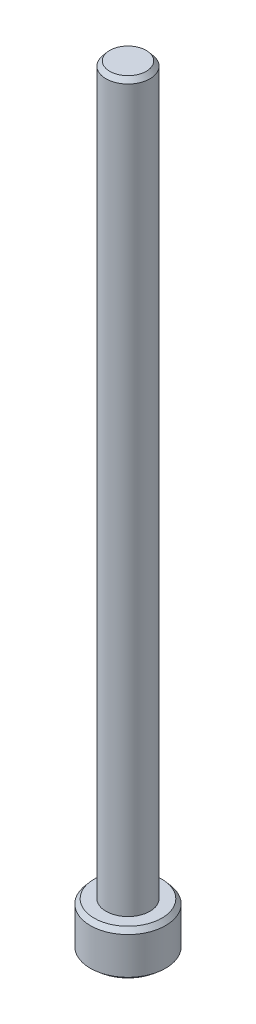
ISO-10303-21;
HEADER;
FILE_DESCRIPTION(('STEP AP214'),'2;1');
FILE_NAME('part.step','',(''),(''),'','','');
FILE_SCHEMA(('AUTOMOTIVE_DESIGN { 1 0 10303 214 1 1 1 1 }'));
ENDSEC;
DATA;
#1=APPLICATION_CONTEXT('core data for automotive mechanical design processes');
#2=APPLICATION_PROTOCOL_DEFINITION('international standard','automotive_design',2000,#1);
#3=PRODUCT_CONTEXT('',#1,'mechanical');
#4=PRODUCT('Part','Part','',(#3));
#5=PRODUCT_RELATED_PRODUCT_CATEGORY('part','',(#4));
#6=PRODUCT_DEFINITION_FORMATION('','',#4);
#7=PRODUCT_DEFINITION_CONTEXT('part definition',#1,'design');
#8=PRODUCT_DEFINITION('design','',#6,#7);
#9=PRODUCT_DEFINITION_SHAPE('','',#8);
#10=(LENGTH_UNIT() NAMED_UNIT(*) SI_UNIT(.MILLI.,.METRE.));
#11=(NAMED_UNIT(*) PLANE_ANGLE_UNIT() SI_UNIT($,.RADIAN.));
#12=(NAMED_UNIT(*) SI_UNIT($,.STERADIAN.) SOLID_ANGLE_UNIT());
#13=UNCERTAINTY_MEASURE_WITH_UNIT(LENGTH_MEASURE(1.E-05),#10,'distance_accuracy_value','');
#14=(GEOMETRIC_REPRESENTATION_CONTEXT(3) GLOBAL_UNCERTAINTY_ASSIGNED_CONTEXT((#13)) GLOBAL_UNIT_ASSIGNED_CONTEXT((#10,
#11,#12)) REPRESENTATION_CONTEXT('',''));
#15=CARTESIAN_POINT('',(0.,0.,0.));
#16=DIRECTION('',(0.,0.,1.));
#17=DIRECTION('',(1.,0.,0.));
#18=AXIS2_PLACEMENT_3D('',#15,#16,#17);
#19=CARTESIAN_POINT('',(0.,5.,0.));
#20=DIRECTION('',(0.,-1.,0.));
#21=DIRECTION('',(0.,0.,-1.));
#22=AXIS2_PLACEMENT_3D('',#19,#20,#21);
#23=CYLINDRICAL_SURFACE('',#22,4.15);
#24=CARTESIAN_POINT('',(0.,0.419549815588637,0.));
#25=DIRECTION('',(0.,1.,0.));
#26=DIRECTION('',(0.,0.,1.));
#27=AXIS2_PLACEMENT_3D('',#24,#25,#26);
#28=CIRCLE('',#27,4.15);
#29=CARTESIAN_POINT('',(0.,0.419549815588637,4.15));
#30=VERTEX_POINT('',#29);
#31=EDGE_CURVE('E181',#30,#30,#28,.T.);
#32=ORIENTED_EDGE('',*,*,#31,.T.);
#33=EDGE_LOOP('',(#32));
#34=FACE_BOUND('',#33,.T.);
#35=CARTESIAN_POINT('',(0.,4.49999999999999,0.));
#36=DIRECTION('',(0.,1.,0.));
#37=DIRECTION('',(0.,0.,1.));
#38=AXIS2_PLACEMENT_3D('',#35,#36,#37);
#39=CIRCLE('',#38,4.15);
#40=CARTESIAN_POINT('',(0.,4.49999999999999,4.15));
#41=VERTEX_POINT('',#40);
#42=EDGE_CURVE('E177',#41,#41,#39,.F.);
#43=ORIENTED_EDGE('',*,*,#42,.T.);
#44=EDGE_LOOP('',(#43));
#45=FACE_BOUND('',#44,.T.);
#46=ADVANCED_FACE('F48',(#34,#45),#23,.T.);
#47=CARTESIAN_POINT('',(0.,5.,0.));
#48=DIRECTION('',(0.,1.,0.));
#49=DIRECTION('',(0.,0.,1.));
#50=AXIS2_PLACEMENT_3D('',#47,#48,#49);
#51=PLANE('',#50);
#52=CARTESIAN_POINT('',(0.,5.,0.));
#53=DIRECTION('',(0.,1.,0.));
#54=DIRECTION('',(0.,0.,1.));
#55=AXIS2_PLACEMENT_3D('',#52,#53,#54);
#56=CIRCLE('',#55,3.73045018441135);
#57=CARTESIAN_POINT('',(0.,5.,3.73045018441135));
#58=VERTEX_POINT('',#57);
#59=EDGE_CURVE('E189',#58,#58,#56,.T.);
#60=ORIENTED_EDGE('',*,*,#59,.T.);
#61=EDGE_LOOP('',(#60));
#62=FACE_BOUND('',#61,.T.);
#63=CARTESIAN_POINT('',(0.,5.,0.));
#64=DIRECTION('',(0.,1.,0.));
#65=DIRECTION('',(0.,0.,1.));
#66=AXIS2_PLACEMENT_3D('',#63,#64,#65);
#67=CIRCLE('',#66,2.425);
#68=CARTESIAN_POINT('',(0.,5.,2.425));
#69=VERTEX_POINT('',#68);
#70=EDGE_CURVE('E165',#69,#69,#67,.T.);
#71=ORIENTED_EDGE('',*,*,#70,.F.);
#72=EDGE_LOOP('',(#71));
#73=FACE_BOUND('',#72,.T.);
#74=ADVANCED_FACE('F208',(#62,#73),#51,.T.);
#75=CARTESIAN_POINT('',(0.,0.,0.));
#76=DIRECTION('',(0.,1.,0.));
#77=DIRECTION('',(0.,0.,1.));
#78=AXIS2_PLACEMENT_3D('',#75,#76,#77);
#79=PLANE('',#78);
#80=CARTESIAN_POINT('',(0.,0.,0.));
#81=DIRECTION('',(0.,1.,0.));
#82=DIRECTION('',(0.,0.,1.));
#83=AXIS2_PLACEMENT_3D('',#80,#81,#82);
#84=CIRCLE('',#83,3.65000000000001);
#85=CARTESIAN_POINT('',(0.,0.,3.65000000000001));
#86=VERTEX_POINT('',#85);
#87=EDGE_CURVE('E185',#86,#86,#84,.F.);
#88=ORIENTED_EDGE('',*,*,#87,.T.);
#89=EDGE_LOOP('',(#88));
#90=FACE_BOUND('',#89,.T.);
#91=DIRECTION('',(-0.866025403784438,0.,-0.500000000000001));
#92=VECTOR('',#91,1.);
#93=CARTESIAN_POINT('',(0.,0.,2.78604186468078));
#94=LINE('',#93,#92);
#95=CARTESIAN_POINT('',(0.,0.,2.78604186468078));
#96=VERTEX_POINT('',#95);
#97=CARTESIAN_POINT('',(-2.41278303082053,0.,1.39302093234039));
#98=VERTEX_POINT('',#97);
#99=EDGE_CURVE('E147',#96,#98,#94,.T.);
#100=ORIENTED_EDGE('',*,*,#99,.F.);
#101=DIRECTION('',(-0.866025403784441,0.,0.499999999999995));
#102=VECTOR('',#101,1.);
#103=CARTESIAN_POINT('',(2.41278303082051,0.,1.39302093234042));
#104=LINE('',#103,#102);
#105=CARTESIAN_POINT('',(2.41278303082051,0.,1.39302093234042));
#106=VERTEX_POINT('',#105);
#107=EDGE_CURVE('E65',#106,#96,#104,.T.);
#108=ORIENTED_EDGE('',*,*,#107,.F.);
#109=DIRECTION('',(0.,0.,1.));
#110=VECTOR('',#109,1.);
#111=CARTESIAN_POINT('',(2.41278303082054,0.,-1.39302093234037));
#112=LINE('',#111,#110);
#113=CARTESIAN_POINT('',(2.41278303082054,0.,-1.39302093234037));
#114=VERTEX_POINT('',#113);
#115=EDGE_CURVE('E159',#114,#106,#112,.T.);
#116=ORIENTED_EDGE('',*,*,#115,.F.);
#117=DIRECTION('',(0.866025403784434,0.,0.500000000000007));
#118=VECTOR('',#117,1.);
#119=CARTESIAN_POINT('',(0.,0.,-2.78604186468078));
#120=LINE('',#119,#118);
#121=CARTESIAN_POINT('',(0.,0.,-2.78604186468078));
#122=VERTEX_POINT('',#121);
#123=EDGE_CURVE('E156',#122,#114,#120,.T.);
#124=ORIENTED_EDGE('',*,*,#123,.F.);
#125=DIRECTION('',(0.866025403784442,0.,-0.499999999999995));
#126=VECTOR('',#125,1.);
#127=CARTESIAN_POINT('',(-2.41278303082052,0.,-1.3930209323404));
#128=LINE('',#127,#126);
#129=CARTESIAN_POINT('',(-2.41278303082052,0.,-1.3930209323404));
#130=VERTEX_POINT('',#129);
#131=EDGE_CURVE('E113',#130,#122,#128,.T.);
#132=ORIENTED_EDGE('',*,*,#131,.F.);
#133=DIRECTION('',(0.,0.,-1.));
#134=VECTOR('',#133,1.);
#135=CARTESIAN_POINT('',(-2.41278303082053,0.,1.39302093234039));
#136=LINE('',#135,#134);
#137=EDGE_CURVE('E151',#98,#130,#136,.T.);
#138=ORIENTED_EDGE('',*,*,#137,.F.);
#139=EDGE_LOOP('',(#100,#108,#116,#124,#132,#138));
#140=FACE_BOUND('',#139,.T.);
#141=ADVANCED_FACE('F214',(#90,#140),#79,.F.);
#142=CARTESIAN_POINT('',(0.,85.,0.));
#143=DIRECTION('',(0.,-1.,0.));
#144=DIRECTION('',(0.,0.,-1.));
#145=AXIS2_PLACEMENT_3D('',#142,#143,#144);
#146=CYLINDRICAL_SURFACE('',#145,2.425);
#147=CARTESIAN_POINT('',(0.,84.5,0.));
#148=DIRECTION('',(0.,1.,0.));
#149=DIRECTION('',(0.,0.,1.));
#150=AXIS2_PLACEMENT_3D('',#147,#148,#149);
#151=CIRCLE('',#150,2.425);
#152=CARTESIAN_POINT('',(0.,84.5,2.425));
#153=VERTEX_POINT('',#152);
#154=EDGE_CURVE('E11',#153,#153,#151,.F.);
#155=ORIENTED_EDGE('',*,*,#154,.T.);
#156=EDGE_LOOP('',(#155));
#157=FACE_BOUND('',#156,.T.);
#158=ORIENTED_EDGE('',*,*,#70,.T.);
#159=EDGE_LOOP('',(#158));
#160=FACE_BOUND('',#159,.T.);
#161=ADVANCED_FACE('F241',(#157,#160),#146,.T.);
#162=CARTESIAN_POINT('',(0.,85.,0.));
#163=DIRECTION('',(0.,1.,0.));
#164=DIRECTION('',(0.,0.,1.));
#165=AXIS2_PLACEMENT_3D('',#162,#163,#164);
#166=PLANE('',#165);
#167=CARTESIAN_POINT('',(0.,85.,0.));
#168=DIRECTION('',(0.,1.,0.));
#169=DIRECTION('',(0.,0.,1.));
#170=AXIS2_PLACEMENT_3D('',#167,#168,#169);
#171=CIRCLE('',#170,2.00545018441137);
#172=CARTESIAN_POINT('',(0.,85.,2.00545018441137));
#173=VERTEX_POINT('',#172);
#174=EDGE_CURVE('E58',#173,#173,#171,.T.);
#175=ORIENTED_EDGE('',*,*,#174,.T.);
#176=EDGE_LOOP('',(#175));
#177=FACE_BOUND('',#176,.T.);
#178=ADVANCED_FACE('F196',(#177),#166,.T.);
#179=CARTESIAN_POINT('',(2.41278303082051,3.,1.39302093234042));
#180=DIRECTION('',(0.499999999999995,0.,0.866025403784441));
#181=DIRECTION('',(0.866025403784441,0.,-0.499999999999995));
#182=AXIS2_PLACEMENT_3D('',#179,#180,#181);
#183=PLANE('',#182);
#184=ORIENTED_EDGE('',*,*,#107,.T.);
#185=DIRECTION('',(0.,-1.,0.));
#186=VECTOR('',#185,1.);
#187=CARTESIAN_POINT('',(0.,3.,2.78604186468078));
#188=LINE('',#187,#186);
#189=CARTESIAN_POINT('',(0.,3.,2.78604186468078));
#190=VERTEX_POINT('',#189);
#191=EDGE_CURVE('E95',#190,#96,#188,.T.);
#192=ORIENTED_EDGE('',*,*,#191,.F.);
#193=DIRECTION('',(-0.866025403784441,0.,0.499999999999995));
#194=VECTOR('',#193,1.);
#195=CARTESIAN_POINT('',(2.41278303082051,3.,1.39302093234042));
#196=LINE('',#195,#194);
#197=CARTESIAN_POINT('',(2.41278303082051,3.,1.39302093234042));
#198=VERTEX_POINT('',#197);
#199=EDGE_CURVE('E162',#198,#190,#196,.T.);
#200=ORIENTED_EDGE('',*,*,#199,.F.);
#201=DIRECTION('',(0.,-1.,0.));
#202=VECTOR('',#201,1.);
#203=CARTESIAN_POINT('',(2.41278303082051,3.,1.39302093234042));
#204=LINE('',#203,#202);
#205=EDGE_CURVE('E73',#198,#106,#204,.T.);
#206=ORIENTED_EDGE('',*,*,#205,.T.);
#207=EDGE_LOOP('',(#184,#192,#200,#206));
#208=FACE_BOUND('',#207,.T.);
#209=ADVANCED_FACE('F293',(#208),#183,.F.);
#210=CARTESIAN_POINT('',(2.41278303082054,3.,-1.39302093234037));
#211=DIRECTION('',(1.,0.,0.));
#212=DIRECTION('',(0.,0.,-1.));
#213=AXIS2_PLACEMENT_3D('',#210,#211,#212);
#214=PLANE('',#213);
#215=ORIENTED_EDGE('',*,*,#115,.T.);
#216=ORIENTED_EDGE('',*,*,#205,.F.);
#217=DIRECTION('',(0.,0.,1.));
#218=VECTOR('',#217,1.);
#219=CARTESIAN_POINT('',(2.41278303082054,3.,-1.39302093234037));
#220=LINE('',#219,#218);
#221=CARTESIAN_POINT('',(2.41278303082054,3.,-1.39302093234037));
#222=VERTEX_POINT('',#221);
#223=EDGE_CURVE('E127',#222,#198,#220,.T.);
#224=ORIENTED_EDGE('',*,*,#223,.F.);
#225=DIRECTION('',(0.,-1.,0.));
#226=VECTOR('',#225,1.);
#227=CARTESIAN_POINT('',(2.41278303082054,3.,-1.39302093234037));
#228=LINE('',#227,#226);
#229=EDGE_CURVE('E118',#222,#114,#228,.T.);
#230=ORIENTED_EDGE('',*,*,#229,.T.);
#231=EDGE_LOOP('',(#215,#216,#224,#230));
#232=FACE_BOUND('',#231,.T.);
#233=ADVANCED_FACE('F301',(#232),#214,.F.);
#234=CARTESIAN_POINT('',(0.,3.,-2.78604186468078));
#235=DIRECTION('',(0.500000000000007,0.,-0.866025403784435));
#236=DIRECTION('',(-0.866025403784434,0.,-0.500000000000007));
#237=AXIS2_PLACEMENT_3D('',#234,#235,#236);
#238=PLANE('',#237);
#239=ORIENTED_EDGE('',*,*,#123,.T.);
#240=ORIENTED_EDGE('',*,*,#229,.F.);
#241=DIRECTION('',(0.866025403784434,0.,0.500000000000007));
#242=VECTOR('',#241,1.);
#243=CARTESIAN_POINT('',(0.,3.,-2.78604186468078));
#244=LINE('',#243,#242);
#245=CARTESIAN_POINT('',(0.,3.,-2.78604186468078));
#246=VERTEX_POINT('',#245);
#247=EDGE_CURVE('E122',#246,#222,#244,.T.);
#248=ORIENTED_EDGE('',*,*,#247,.F.);
#249=DIRECTION('',(0.,-1.,0.));
#250=VECTOR('',#249,1.);
#251=CARTESIAN_POINT('',(0.,3.,-2.78604186468078));
#252=LINE('',#251,#250);
#253=EDGE_CURVE('E106',#246,#122,#252,.T.);
#254=ORIENTED_EDGE('',*,*,#253,.T.);
#255=EDGE_LOOP('',(#239,#240,#248,#254));
#256=FACE_BOUND('',#255,.T.);
#257=ADVANCED_FACE('F123',(#256),#238,.F.);
#258=CARTESIAN_POINT('',(-2.41278303082052,3.,-1.3930209323404));
#259=DIRECTION('',(-0.499999999999995,0.,-0.866025403784441));
#260=DIRECTION('',(-0.866025403784442,0.,0.499999999999995));
#261=AXIS2_PLACEMENT_3D('',#258,#259,#260);
#262=PLANE('',#261);
#263=ORIENTED_EDGE('',*,*,#131,.T.);
#264=ORIENTED_EDGE('',*,*,#253,.F.);
#265=DIRECTION('',(0.866025403784442,0.,-0.499999999999995));
#266=VECTOR('',#265,1.);
#267=CARTESIAN_POINT('',(-2.41278303082052,3.,-1.3930209323404));
#268=LINE('',#267,#266);
#269=CARTESIAN_POINT('',(-2.41278303082052,3.,-1.3930209323404));
#270=VERTEX_POINT('',#269);
#271=EDGE_CURVE('E110',#270,#246,#268,.T.);
#272=ORIENTED_EDGE('',*,*,#271,.F.);
#273=DIRECTION('',(0.,-1.,0.));
#274=VECTOR('',#273,1.);
#275=CARTESIAN_POINT('',(-2.41278303082052,3.,-1.3930209323404));
#276=LINE('',#275,#274);
#277=EDGE_CURVE('E119',#270,#130,#276,.T.);
#278=ORIENTED_EDGE('',*,*,#277,.T.);
#279=EDGE_LOOP('',(#263,#264,#272,#278));
#280=FACE_BOUND('',#279,.T.);
#281=ADVANCED_FACE('F108',(#280),#262,.F.);
#282=CARTESIAN_POINT('',(-2.41278303082053,3.,1.39302093234039));
#283=DIRECTION('',(-1.,0.,0.));
#284=DIRECTION('',(0.,0.,1.));
#285=AXIS2_PLACEMENT_3D('',#282,#283,#284);
#286=PLANE('',#285);
#287=ORIENTED_EDGE('',*,*,#137,.T.);
#288=ORIENTED_EDGE('',*,*,#277,.F.);
#289=DIRECTION('',(0.,0.,-1.));
#290=VECTOR('',#289,1.);
#291=CARTESIAN_POINT('',(-2.41278303082053,3.,1.39302093234039));
#292=LINE('',#291,#290);
#293=CARTESIAN_POINT('',(-2.41278303082053,3.,1.39302093234039));
#294=VERTEX_POINT('',#293);
#295=EDGE_CURVE('E133',#294,#270,#292,.T.);
#296=ORIENTED_EDGE('',*,*,#295,.F.);
#297=DIRECTION('',(0.,-1.,0.));
#298=VECTOR('',#297,1.);
#299=CARTESIAN_POINT('',(-2.41278303082053,3.,1.39302093234039));
#300=LINE('',#299,#298);
#301=EDGE_CURVE('E169',#294,#98,#300,.T.);
#302=ORIENTED_EDGE('',*,*,#301,.T.);
#303=EDGE_LOOP('',(#287,#288,#296,#302));
#304=FACE_BOUND('',#303,.T.);
#305=ADVANCED_FACE('F323',(#304),#286,.F.);
#306=CARTESIAN_POINT('',(0.,3.,2.78604186468078));
#307=DIRECTION('',(-0.500000000000001,0.,0.866025403784438));
#308=DIRECTION('',(0.866025403784438,0.,0.500000000000001));
#309=AXIS2_PLACEMENT_3D('',#306,#307,#308);
#310=PLANE('',#309);
#311=ORIENTED_EDGE('',*,*,#99,.T.);
#312=ORIENTED_EDGE('',*,*,#301,.F.);
#313=DIRECTION('',(-0.866025403784438,0.,-0.500000000000001));
#314=VECTOR('',#313,1.);
#315=CARTESIAN_POINT('',(0.,3.,2.78604186468078));
#316=LINE('',#315,#314);
#317=EDGE_CURVE('E139',#190,#294,#316,.T.);
#318=ORIENTED_EDGE('',*,*,#317,.F.);
#319=ORIENTED_EDGE('',*,*,#191,.T.);
#320=EDGE_LOOP('',(#311,#312,#318,#319));
#321=FACE_BOUND('',#320,.T.);
#322=ADVANCED_FACE('F233',(#321),#310,.F.);
#323=CARTESIAN_POINT('',(0.,3.,0.));
#324=DIRECTION('',(0.,-1.,0.));
#325=DIRECTION('',(0.,0.,-1.));
#326=AXIS2_PLACEMENT_3D('',#323,#324,#325);
#327=PLANE('',#326);
#328=ORIENTED_EDGE('',*,*,#199,.T.);
#329=ORIENTED_EDGE('',*,*,#317,.T.);
#330=ORIENTED_EDGE('',*,*,#295,.T.);
#331=ORIENTED_EDGE('',*,*,#271,.T.);
#332=ORIENTED_EDGE('',*,*,#247,.T.);
#333=ORIENTED_EDGE('',*,*,#223,.T.);
#334=EDGE_LOOP('',(#328,#329,#330,#331,#332,#333));
#335=FACE_BOUND('',#334,.T.);
#336=ADVANCED_FACE('F130',(#335),#327,.T.);
#337=CARTESIAN_POINT('',(0.,0.419549815588637,0.));
#338=DIRECTION('',(0.,1.,0.));
#339=DIRECTION('',(0.,0.,1.));
#340=AXIS2_PLACEMENT_3D('',#337,#338,#339);
#341=CONICAL_SURFACE('',#340,4.15,0.872664625997161);
#342=ORIENTED_EDGE('',*,*,#87,.F.);
#343=EDGE_LOOP('',(#342));
#344=FACE_BOUND('',#343,.T.);
#345=ORIENTED_EDGE('',*,*,#31,.F.);
#346=EDGE_LOOP('',(#345));
#347=FACE_BOUND('',#346,.T.);
#348=ADVANCED_FACE('F204',(#344,#347),#341,.T.);
#349=CARTESIAN_POINT('',(0.,5.,0.));
#350=DIRECTION('',(0.,-1.,0.));
#351=DIRECTION('',(0.,0.,-1.));
#352=AXIS2_PLACEMENT_3D('',#349,#350,#351);
#353=CONICAL_SURFACE('',#352,3.73045018441135,0.698131700797731);
#354=ORIENTED_EDGE('',*,*,#42,.F.);
#355=EDGE_LOOP('',(#354));
#356=FACE_BOUND('',#355,.T.);
#357=ORIENTED_EDGE('',*,*,#59,.F.);
#358=EDGE_LOOP('',(#357));
#359=FACE_BOUND('',#358,.T.);
#360=ADVANCED_FACE('F199',(#356,#359),#353,.T.);
#361=CARTESIAN_POINT('',(0.,85.,0.));
#362=DIRECTION('',(0.,-1.,0.));
#363=DIRECTION('',(0.,0.,-1.));
#364=AXIS2_PLACEMENT_3D('',#361,#362,#363);
#365=CONICAL_SURFACE('',#364,2.00545018441137,0.698131700797736);
#366=ORIENTED_EDGE('',*,*,#154,.F.);
#367=EDGE_LOOP('',(#366));
#368=FACE_BOUND('',#367,.T.);
#369=ORIENTED_EDGE('',*,*,#174,.F.);
#370=EDGE_LOOP('',(#369));
#371=FACE_BOUND('',#370,.T.);
#372=ADVANCED_FACE('F51',(#368,#371),#365,.T.);
#373=CLOSED_SHELL('',(#46,#74,#141,#161,#178,#209,#233,#257,#281,#305,#322,#336,#348,#360,#372));
#374=MANIFOLD_SOLID_BREP('B2',#373);
#375=ADVANCED_BREP_SHAPE_REPRESENTATION('',(#18,#374),#14);
#376=SHAPE_DEFINITION_REPRESENTATION(#9,#375);
ENDSEC;
END-ISO-10303-21;
